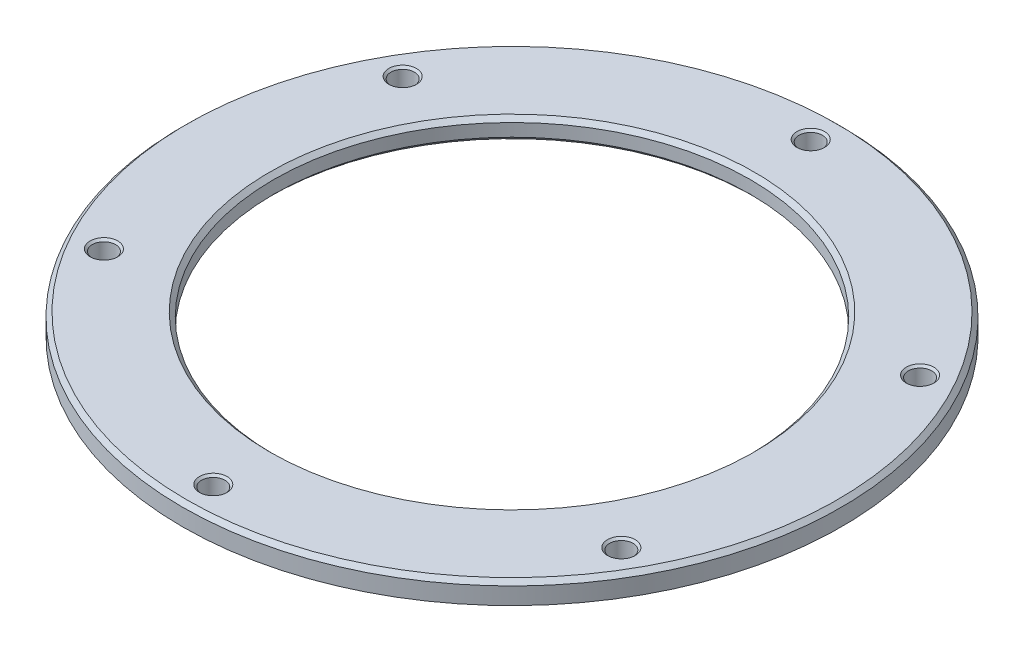
ISO-10303-21;
HEADER;
FILE_DESCRIPTION(('STEP AP214'),'2;1');
FILE_NAME('part.step','',(''),(''),'','','');
FILE_SCHEMA(('AUTOMOTIVE_DESIGN { 1 0 10303 214 1 1 1 1 }'));
ENDSEC;
DATA;
#1=APPLICATION_CONTEXT('core data for automotive mechanical design processes');
#2=APPLICATION_PROTOCOL_DEFINITION('international standard','automotive_design',2000,#1);
#3=PRODUCT_CONTEXT('',#1,'mechanical');
#4=PRODUCT('Part','Part','',(#3));
#5=PRODUCT_RELATED_PRODUCT_CATEGORY('part','',(#4));
#6=PRODUCT_DEFINITION_FORMATION('','',#4);
#7=PRODUCT_DEFINITION_CONTEXT('part definition',#1,'design');
#8=PRODUCT_DEFINITION('design','',#6,#7);
#9=PRODUCT_DEFINITION_SHAPE('','',#8);
#10=(LENGTH_UNIT() NAMED_UNIT(*) SI_UNIT(.MILLI.,.METRE.));
#11=(NAMED_UNIT(*) PLANE_ANGLE_UNIT() SI_UNIT($,.RADIAN.));
#12=(NAMED_UNIT(*) SI_UNIT($,.STERADIAN.) SOLID_ANGLE_UNIT());
#13=UNCERTAINTY_MEASURE_WITH_UNIT(LENGTH_MEASURE(1.E-05),#10,'distance_accuracy_value','');
#14=(GEOMETRIC_REPRESENTATION_CONTEXT(3) GLOBAL_UNCERTAINTY_ASSIGNED_CONTEXT((#13)) GLOBAL_UNIT_ASSIGNED_CONTEXT((#10,
#11,#12)) REPRESENTATION_CONTEXT('',''));
#15=CARTESIAN_POINT('',(0.,0.,0.));
#16=DIRECTION('',(0.,0.,1.));
#17=DIRECTION('',(1.,0.,0.));
#18=AXIS2_PLACEMENT_3D('',#15,#16,#17);
#19=CARTESIAN_POINT('',(0.,5.,0.));
#20=DIRECTION('',(0.,1.,0.));
#21=DIRECTION('',(0.,0.,1.));
#22=AXIS2_PLACEMENT_3D('',#19,#20,#21);
#23=PLANE('',#22);
#24=CARTESIAN_POINT('',(0.,5.,0.));
#25=DIRECTION('',(0.,1.,0.));
#26=DIRECTION('',(0.,0.,1.));
#27=AXIS2_PLACEMENT_3D('',#24,#25,#26);
#28=CIRCLE('',#27,57.);
#29=CARTESIAN_POINT('',(0.,5.,57.));
#30=VERTEX_POINT('',#29);
#31=EDGE_CURVE('E43',#30,#30,#28,.F.);
#32=ORIENTED_EDGE('',*,*,#31,.T.);
#33=EDGE_LOOP('',(#32));
#34=FACE_BOUND('',#33,.T.);
#35=CARTESIAN_POINT('',(0.,5.,0.));
#36=DIRECTION('',(0.,1.,0.));
#37=DIRECTION('',(0.,0.,1.));
#38=AXIS2_PLACEMENT_3D('',#35,#36,#37);
#39=CIRCLE('',#38,76.5);
#40=CARTESIAN_POINT('',(0.,5.,76.5));
#41=VERTEX_POINT('',#40);
#42=EDGE_CURVE('E47',#41,#41,#39,.T.);
#43=ORIENTED_EDGE('',*,*,#42,.T.);
#44=EDGE_LOOP('',(#43));
#45=FACE_BOUND('',#44,.T.);
#46=CARTESIAN_POINT('',(60.8382846158564,5.,-35.1250000000007));
#47=DIRECTION('',(0.,1.,0.));
#48=DIRECTION('',(0.,0.,1.));
#49=AXIS2_PLACEMENT_3D('',#46,#47,#48);
#50=CIRCLE('',#49,3.25000000000001);
#51=CARTESIAN_POINT('',(60.8382846158564,5.,-31.8750000000007));
#52=VERTEX_POINT('',#51);
#53=EDGE_CURVE('E65',#52,#52,#50,.F.);
#54=ORIENTED_EDGE('',*,*,#53,.T.);
#55=EDGE_LOOP('',(#54));
#56=FACE_BOUND('',#55,.T.);
#57=CARTESIAN_POINT('',(60.8382846158571,5.,35.1249999999994));
#58=DIRECTION('',(0.,1.,0.));
#59=DIRECTION('',(0.,0.,1.));
#60=AXIS2_PLACEMENT_3D('',#57,#58,#59);
#61=CIRCLE('',#60,3.24999999999998);
#62=CARTESIAN_POINT('',(60.8382846158571,5.,38.3749999999994));
#63=VERTEX_POINT('',#62);
#64=EDGE_CURVE('E77',#63,#63,#61,.F.);
#65=ORIENTED_EDGE('',*,*,#64,.T.);
#66=EDGE_LOOP('',(#65));
#67=FACE_BOUND('',#66,.T.);
#68=CARTESIAN_POINT('',(0.,5.,70.25));
#69=DIRECTION('',(0.,1.,0.));
#70=DIRECTION('',(0.,0.,1.));
#71=AXIS2_PLACEMENT_3D('',#68,#69,#70);
#72=CIRCLE('',#71,3.25);
#73=CARTESIAN_POINT('',(0.,5.,73.5));
#74=VERTEX_POINT('',#73);
#75=EDGE_CURVE('E89',#74,#74,#72,.F.);
#76=ORIENTED_EDGE('',*,*,#75,.T.);
#77=EDGE_LOOP('',(#76));
#78=FACE_BOUND('',#77,.T.);
#79=CARTESIAN_POINT('',(-60.8382846158567,5.,35.1250000000003));
#80=DIRECTION('',(0.,1.,0.));
#81=DIRECTION('',(0.,0.,1.));
#82=AXIS2_PLACEMENT_3D('',#79,#80,#81);
#83=CIRCLE('',#82,3.25);
#84=CARTESIAN_POINT('',(-60.8382846158567,5.,38.3750000000003));
#85=VERTEX_POINT('',#84);
#86=EDGE_CURVE('E101',#85,#85,#83,.F.);
#87=ORIENTED_EDGE('',*,*,#86,.T.);
#88=EDGE_LOOP('',(#87));
#89=FACE_BOUND('',#88,.T.);
#90=CARTESIAN_POINT('',(-60.8382846158569,5.,-35.1249999999999));
#91=DIRECTION('',(0.,1.,0.));
#92=DIRECTION('',(0.,0.,1.));
#93=AXIS2_PLACEMENT_3D('',#90,#91,#92);
#94=CIRCLE('',#93,3.24999999999999);
#95=CARTESIAN_POINT('',(-60.8382846158569,5.,-31.8749999999999));
#96=VERTEX_POINT('',#95);
#97=EDGE_CURVE('E113',#96,#96,#94,.F.);
#98=ORIENTED_EDGE('',*,*,#97,.T.);
#99=EDGE_LOOP('',(#98));
#100=FACE_BOUND('',#99,.T.);
#101=CARTESIAN_POINT('',(0.,5.,-70.25));
#102=DIRECTION('',(0.,1.,0.));
#103=DIRECTION('',(0.,0.,1.));
#104=AXIS2_PLACEMENT_3D('',#101,#102,#103);
#105=CIRCLE('',#104,3.25);
#106=CARTESIAN_POINT('',(0.,5.,-67.));
#107=VERTEX_POINT('',#106);
#108=EDGE_CURVE('E125',#107,#107,#105,.F.);
#109=ORIENTED_EDGE('',*,*,#108,.T.);
#110=EDGE_LOOP('',(#109));
#111=FACE_BOUND('',#110,.T.);
#112=ADVANCED_FACE('F35',(#34,#45,#56,#67,#78,#89,#100,#111),#23,.T.);
#113=CARTESIAN_POINT('',(0.,0.,0.));
#114=DIRECTION('',(0.,1.,0.));
#115=DIRECTION('',(0.,0.,1.));
#116=AXIS2_PLACEMENT_3D('',#113,#114,#115);
#117=PLANE('',#116);
#118=CARTESIAN_POINT('',(0.,0.,0.));
#119=DIRECTION('',(0.,1.,0.));
#120=DIRECTION('',(0.,0.,1.));
#121=AXIS2_PLACEMENT_3D('',#118,#119,#120);
#122=CIRCLE('',#121,57.);
#123=CARTESIAN_POINT('',(0.,0.,57.));
#124=VERTEX_POINT('',#123);
#125=EDGE_CURVE('E59',#124,#124,#122,.T.);
#126=ORIENTED_EDGE('',*,*,#125,.T.);
#127=EDGE_LOOP('',(#126));
#128=FACE_BOUND('',#127,.T.);
#129=CARTESIAN_POINT('',(60.8382846158564,0.,-35.1250000000007));
#130=DIRECTION('',(0.,1.,0.));
#131=DIRECTION('',(0.,0.,1.));
#132=AXIS2_PLACEMENT_3D('',#129,#130,#131);
#133=CIRCLE('',#132,3.24999999999997);
#134=CARTESIAN_POINT('',(60.8382846158564,0.,-31.8750000000007));
#135=VERTEX_POINT('',#134);
#136=EDGE_CURVE('E62',#135,#135,#133,.T.);
#137=ORIENTED_EDGE('',*,*,#136,.T.);
#138=EDGE_LOOP('',(#137));
#139=FACE_BOUND('',#138,.T.);
#140=CARTESIAN_POINT('',(60.8382846158571,0.,35.1249999999994));
#141=DIRECTION('',(0.,1.,0.));
#142=DIRECTION('',(0.,0.,1.));
#143=AXIS2_PLACEMENT_3D('',#140,#141,#142);
#144=CIRCLE('',#143,3.25000000000003);
#145=CARTESIAN_POINT('',(60.8382846158571,0.,38.3749999999995));
#146=VERTEX_POINT('',#145);
#147=EDGE_CURVE('E74',#146,#146,#144,.T.);
#148=ORIENTED_EDGE('',*,*,#147,.T.);
#149=EDGE_LOOP('',(#148));
#150=FACE_BOUND('',#149,.T.);
#151=CARTESIAN_POINT('',(0.,0.,70.25));
#152=DIRECTION('',(0.,1.,0.));
#153=DIRECTION('',(0.,0.,1.));
#154=AXIS2_PLACEMENT_3D('',#151,#152,#153);
#155=CIRCLE('',#154,3.24999999999995);
#156=CARTESIAN_POINT('',(0.,0.,73.5));
#157=VERTEX_POINT('',#156);
#158=EDGE_CURVE('E86',#157,#157,#155,.T.);
#159=ORIENTED_EDGE('',*,*,#158,.T.);
#160=EDGE_LOOP('',(#159));
#161=FACE_BOUND('',#160,.T.);
#162=CARTESIAN_POINT('',(-60.8382846158567,0.,35.1250000000003));
#163=DIRECTION('',(0.,1.,0.));
#164=DIRECTION('',(0.,0.,1.));
#165=AXIS2_PLACEMENT_3D('',#162,#163,#164);
#166=CIRCLE('',#165,3.24999999999999);
#167=CARTESIAN_POINT('',(-60.8382846158567,0.,38.3750000000003));
#168=VERTEX_POINT('',#167);
#169=EDGE_CURVE('E98',#168,#168,#166,.T.);
#170=ORIENTED_EDGE('',*,*,#169,.T.);
#171=EDGE_LOOP('',(#170));
#172=FACE_BOUND('',#171,.T.);
#173=CARTESIAN_POINT('',(-60.8382846158569,0.,-35.1249999999999));
#174=DIRECTION('',(0.,1.,0.));
#175=DIRECTION('',(0.,0.,1.));
#176=AXIS2_PLACEMENT_3D('',#173,#174,#175);
#177=CIRCLE('',#176,3.24999999999995);
#178=CARTESIAN_POINT('',(-60.8382846158569,0.,-31.8749999999999));
#179=VERTEX_POINT('',#178);
#180=EDGE_CURVE('E110',#179,#179,#177,.T.);
#181=ORIENTED_EDGE('',*,*,#180,.T.);
#182=EDGE_LOOP('',(#181));
#183=FACE_BOUND('',#182,.T.);
#184=CARTESIAN_POINT('',(0.,0.,-70.25));
#185=DIRECTION('',(0.,1.,0.));
#186=DIRECTION('',(0.,0.,1.));
#187=AXIS2_PLACEMENT_3D('',#184,#185,#186);
#188=CIRCLE('',#187,3.24999999999995);
#189=CARTESIAN_POINT('',(0.,0.,-67.0000000000001));
#190=VERTEX_POINT('',#189);
#191=EDGE_CURVE('E122',#190,#190,#188,.T.);
#192=ORIENTED_EDGE('',*,*,#191,.T.);
#193=EDGE_LOOP('',(#192));
#194=FACE_BOUND('',#193,.T.);
#195=CARTESIAN_POINT('',(0.,0.,0.));
#196=DIRECTION('',(0.,1.,0.));
#197=DIRECTION('',(0.,0.,1.));
#198=AXIS2_PLACEMENT_3D('',#195,#196,#197);
#199=CIRCLE('',#198,77.5);
#200=CARTESIAN_POINT('',(0.,0.,77.5));
#201=VERTEX_POINT('',#200);
#202=EDGE_CURVE('E134',#201,#201,#199,.T.);
#203=ORIENTED_EDGE('',*,*,#202,.F.);
#204=EDGE_LOOP('',(#203));
#205=FACE_BOUND('',#204,.T.);
#206=ADVANCED_FACE('F140',(#128,#139,#150,#161,#172,#183,#194,#205),#117,.F.);
#207=CARTESIAN_POINT('',(0.,5.,0.));
#208=DIRECTION('',(0.,-1.,0.));
#209=DIRECTION('',(0.,0.,-1.));
#210=AXIS2_PLACEMENT_3D('',#207,#208,#209);
#211=CYLINDRICAL_SURFACE('',#210,77.5);
#212=CARTESIAN_POINT('',(0.,3.99999999999997,0.));
#213=DIRECTION('',(0.,1.,0.));
#214=DIRECTION('',(0.,0.,1.));
#215=AXIS2_PLACEMENT_3D('',#212,#213,#214);
#216=CIRCLE('',#215,77.5);
#217=CARTESIAN_POINT('',(0.,3.99999999999997,77.5));
#218=VERTEX_POINT('',#217);
#219=EDGE_CURVE('E10',#218,#218,#216,.F.);
#220=ORIENTED_EDGE('',*,*,#219,.T.);
#221=EDGE_LOOP('',(#220));
#222=FACE_BOUND('',#221,.T.);
#223=ORIENTED_EDGE('',*,*,#202,.T.);
#224=EDGE_LOOP('',(#223));
#225=FACE_BOUND('',#224,.T.);
#226=ADVANCED_FACE('F138',(#222,#225),#211,.T.);
#227=CARTESIAN_POINT('',(0.,5.,0.));
#228=DIRECTION('',(0.,-1.,0.));
#229=DIRECTION('',(0.,0.,-1.));
#230=AXIS2_PLACEMENT_3D('',#227,#228,#229);
#231=CYLINDRICAL_SURFACE('',#230,56.);
#232=CARTESIAN_POINT('',(0.,1.00000000000001,0.));
#233=DIRECTION('',(0.,1.,0.));
#234=DIRECTION('',(0.,0.,1.));
#235=AXIS2_PLACEMENT_3D('',#232,#233,#234);
#236=CIRCLE('',#235,56.);
#237=CARTESIAN_POINT('',(0.,1.00000000000001,56.));
#238=VERTEX_POINT('',#237);
#239=EDGE_CURVE('E51',#238,#238,#236,.F.);
#240=ORIENTED_EDGE('',*,*,#239,.T.);
#241=EDGE_LOOP('',(#240));
#242=FACE_BOUND('',#241,.T.);
#243=CARTESIAN_POINT('',(0.,3.99999999999995,0.));
#244=DIRECTION('',(0.,1.,0.));
#245=DIRECTION('',(0.,0.,1.));
#246=AXIS2_PLACEMENT_3D('',#243,#244,#245);
#247=CIRCLE('',#246,56.);
#248=CARTESIAN_POINT('',(0.,3.99999999999995,56.));
#249=VERTEX_POINT('',#248);
#250=EDGE_CURVE('E56',#249,#249,#247,.T.);
#251=ORIENTED_EDGE('',*,*,#250,.T.);
#252=EDGE_LOOP('',(#251));
#253=FACE_BOUND('',#252,.T.);
#254=ADVANCED_FACE('F148',(#242,#253),#231,.F.);
#255=CARTESIAN_POINT('',(0.,0.,-70.25));
#256=DIRECTION('',(0.,1.,0.));
#257=DIRECTION('',(0.,0.,1.));
#258=AXIS2_PLACEMENT_3D('',#255,#256,#257);
#259=CYLINDRICAL_SURFACE('',#258,2.75);
#260=CARTESIAN_POINT('',(0.,4.49999999999996,-70.25));
#261=DIRECTION('',(0.,1.,0.));
#262=DIRECTION('',(0.,0.,1.));
#263=AXIS2_PLACEMENT_3D('',#260,#261,#262);
#264=CIRCLE('',#263,2.75);
#265=CARTESIAN_POINT('',(0.,4.49999999999996,-67.5));
#266=VERTEX_POINT('',#265);
#267=EDGE_CURVE('E128',#266,#266,#264,.T.);
#268=ORIENTED_EDGE('',*,*,#267,.T.);
#269=EDGE_LOOP('',(#268));
#270=FACE_BOUND('',#269,.T.);
#271=CARTESIAN_POINT('',(0.,0.499999999999956,-70.25));
#272=DIRECTION('',(0.,1.,0.));
#273=DIRECTION('',(0.,0.,1.));
#274=AXIS2_PLACEMENT_3D('',#271,#272,#273);
#275=CIRCLE('',#274,2.75);
#276=CARTESIAN_POINT('',(0.,0.499999999999956,-67.5));
#277=VERTEX_POINT('',#276);
#278=EDGE_CURVE('E131',#277,#277,#275,.F.);
#279=ORIENTED_EDGE('',*,*,#278,.T.);
#280=EDGE_LOOP('',(#279));
#281=FACE_BOUND('',#280,.T.);
#282=ADVANCED_FACE('F162',(#270,#281),#259,.F.);
#283=CARTESIAN_POINT('',(0.,4.49999999999996,-70.25));
#284=DIRECTION('',(0.,1.,0.));
#285=DIRECTION('',(0.,0.,1.));
#286=AXIS2_PLACEMENT_3D('',#283,#284,#285);
#287=CONICAL_SURFACE('',#286,2.75,0.785398163397411);
#288=ORIENTED_EDGE('',*,*,#108,.F.);
#289=EDGE_LOOP('',(#288));
#290=FACE_BOUND('',#289,.T.);
#291=ORIENTED_EDGE('',*,*,#267,.F.);
#292=EDGE_LOOP('',(#291));
#293=FACE_BOUND('',#292,.T.);
#294=ADVANCED_FACE('F155',(#290,#293),#287,.F.);
#295=CARTESIAN_POINT('',(0.,0.,-70.25));
#296=DIRECTION('',(0.,-1.,0.));
#297=DIRECTION('',(0.,0.,-1.));
#298=AXIS2_PLACEMENT_3D('',#295,#296,#297);
#299=CONICAL_SURFACE('',#298,3.24999999999995,0.785398163397439);
#300=ORIENTED_EDGE('',*,*,#278,.F.);
#301=EDGE_LOOP('',(#300));
#302=FACE_BOUND('',#301,.T.);
#303=ORIENTED_EDGE('',*,*,#191,.F.);
#304=EDGE_LOOP('',(#303));
#305=FACE_BOUND('',#304,.T.);
#306=ADVANCED_FACE('F161',(#302,#305),#299,.F.);
#307=CARTESIAN_POINT('',(-60.8382846158569,0.,-35.1249999999999));
#308=DIRECTION('',(0.,1.,0.));
#309=DIRECTION('',(0.,0.,1.));
#310=AXIS2_PLACEMENT_3D('',#307,#308,#309);
#311=CYLINDRICAL_SURFACE('',#310,2.75);
#312=CARTESIAN_POINT('',(-60.8382846158569,4.50000000000002,-35.1249999999999));
#313=DIRECTION('',(0.,1.,0.));
#314=DIRECTION('',(0.,0.,1.));
#315=AXIS2_PLACEMENT_3D('',#312,#313,#314);
#316=CIRCLE('',#315,2.75);
#317=CARTESIAN_POINT('',(-60.8382846158569,4.50000000000002,-32.3749999999999));
#318=VERTEX_POINT('',#317);
#319=EDGE_CURVE('E116',#318,#318,#316,.T.);
#320=ORIENTED_EDGE('',*,*,#319,.T.);
#321=EDGE_LOOP('',(#320));
#322=FACE_BOUND('',#321,.T.);
#323=CARTESIAN_POINT('',(-60.8382846158569,0.499999999999928,-35.1249999999999));
#324=DIRECTION('',(0.,1.,0.));
#325=DIRECTION('',(0.,0.,1.));
#326=AXIS2_PLACEMENT_3D('',#323,#324,#325);
#327=CIRCLE('',#326,2.75);
#328=CARTESIAN_POINT('',(-60.8382846158569,0.499999999999928,-32.3749999999999));
#329=VERTEX_POINT('',#328);
#330=EDGE_CURVE('E119',#329,#329,#327,.F.);
#331=ORIENTED_EDGE('',*,*,#330,.T.);
#332=EDGE_LOOP('',(#331));
#333=FACE_BOUND('',#332,.T.);
#334=ADVANCED_FACE('F169',(#322,#333),#311,.F.);
#335=CARTESIAN_POINT('',(-60.8382846158567,0.,35.1250000000003));
#336=DIRECTION('',(0.,1.,0.));
#337=DIRECTION('',(0.,0.,1.));
#338=AXIS2_PLACEMENT_3D('',#335,#336,#337);
#339=CYLINDRICAL_SURFACE('',#338,2.75);
#340=CARTESIAN_POINT('',(-60.8382846158567,4.49999999999999,35.1250000000003));
#341=DIRECTION('',(0.,1.,0.));
#342=DIRECTION('',(0.,0.,1.));
#343=AXIS2_PLACEMENT_3D('',#340,#341,#342);
#344=CIRCLE('',#343,2.75);
#345=CARTESIAN_POINT('',(-60.8382846158567,4.49999999999999,37.8750000000003));
#346=VERTEX_POINT('',#345);
#347=EDGE_CURVE('E104',#346,#346,#344,.T.);
#348=ORIENTED_EDGE('',*,*,#347,.T.);
#349=EDGE_LOOP('',(#348));
#350=FACE_BOUND('',#349,.T.);
#351=CARTESIAN_POINT('',(-60.8382846158567,0.500000000000011,35.1250000000003));
#352=DIRECTION('',(0.,1.,0.));
#353=DIRECTION('',(0.,0.,1.));
#354=AXIS2_PLACEMENT_3D('',#351,#352,#353);
#355=CIRCLE('',#354,2.75);
#356=CARTESIAN_POINT('',(-60.8382846158567,0.500000000000011,37.8750000000003));
#357=VERTEX_POINT('',#356);
#358=EDGE_CURVE('E107',#357,#357,#355,.F.);
#359=ORIENTED_EDGE('',*,*,#358,.T.);
#360=EDGE_LOOP('',(#359));
#361=FACE_BOUND('',#360,.T.);
#362=ADVANCED_FACE('F270',(#350,#361),#339,.F.);
#363=CARTESIAN_POINT('',(0.,0.,70.25));
#364=DIRECTION('',(0.,1.,0.));
#365=DIRECTION('',(0.,0.,1.));
#366=AXIS2_PLACEMENT_3D('',#363,#364,#365);
#367=CYLINDRICAL_SURFACE('',#366,2.75);
#368=CARTESIAN_POINT('',(0.,4.49999999999996,70.25));
#369=DIRECTION('',(0.,1.,0.));
#370=DIRECTION('',(0.,0.,1.));
#371=AXIS2_PLACEMENT_3D('',#368,#369,#370);
#372=CIRCLE('',#371,2.75);
#373=CARTESIAN_POINT('',(0.,4.49999999999996,73.));
#374=VERTEX_POINT('',#373);
#375=EDGE_CURVE('E92',#374,#374,#372,.T.);
#376=ORIENTED_EDGE('',*,*,#375,.T.);
#377=EDGE_LOOP('',(#376));
#378=FACE_BOUND('',#377,.T.);
#379=CARTESIAN_POINT('',(0.,0.499999999999956,70.25));
#380=DIRECTION('',(0.,1.,0.));
#381=DIRECTION('',(0.,0.,1.));
#382=AXIS2_PLACEMENT_3D('',#379,#380,#381);
#383=CIRCLE('',#382,2.75);
#384=CARTESIAN_POINT('',(0.,0.499999999999956,73.));
#385=VERTEX_POINT('',#384);
#386=EDGE_CURVE('E95',#385,#385,#383,.F.);
#387=ORIENTED_EDGE('',*,*,#386,.T.);
#388=EDGE_LOOP('',(#387));
#389=FACE_BOUND('',#388,.T.);
#390=ADVANCED_FACE('F278',(#378,#389),#367,.F.);
#391=CARTESIAN_POINT('',(60.8382846158571,0.,35.1249999999994));
#392=DIRECTION('',(0.,1.,0.));
#393=DIRECTION('',(0.,0.,1.));
#394=AXIS2_PLACEMENT_3D('',#391,#392,#393);
#395=CYLINDRICAL_SURFACE('',#394,2.75);
#396=CARTESIAN_POINT('',(60.8382846158571,4.50000000000002,35.1249999999994));
#397=DIRECTION('',(0.,1.,0.));
#398=DIRECTION('',(0.,0.,1.));
#399=AXIS2_PLACEMENT_3D('',#396,#397,#398);
#400=CIRCLE('',#399,2.75);
#401=CARTESIAN_POINT('',(60.8382846158571,4.50000000000002,37.8749999999994));
#402=VERTEX_POINT('',#401);
#403=EDGE_CURVE('E80',#402,#402,#400,.T.);
#404=ORIENTED_EDGE('',*,*,#403,.T.);
#405=EDGE_LOOP('',(#404));
#406=FACE_BOUND('',#405,.T.);
#407=CARTESIAN_POINT('',(60.8382846158571,0.500000000000012,35.1249999999994));
#408=DIRECTION('',(0.,1.,0.));
#409=DIRECTION('',(0.,0.,1.));
#410=AXIS2_PLACEMENT_3D('',#407,#408,#409);
#411=CIRCLE('',#410,2.75);
#412=CARTESIAN_POINT('',(60.8382846158571,0.500000000000012,37.8749999999994));
#413=VERTEX_POINT('',#412);
#414=EDGE_CURVE('E83',#413,#413,#411,.F.);
#415=ORIENTED_EDGE('',*,*,#414,.T.);
#416=EDGE_LOOP('',(#415));
#417=FACE_BOUND('',#416,.T.);
#418=ADVANCED_FACE('F274',(#406,#417),#395,.F.);
#419=CARTESIAN_POINT('',(60.8382846158564,0.,-35.1250000000007));
#420=DIRECTION('',(0.,1.,0.));
#421=DIRECTION('',(0.,0.,1.));
#422=AXIS2_PLACEMENT_3D('',#419,#420,#421);
#423=CYLINDRICAL_SURFACE('',#422,2.75);
#424=CARTESIAN_POINT('',(60.8382846158564,4.49999999999996,-35.1250000000007));
#425=DIRECTION('',(0.,1.,0.));
#426=DIRECTION('',(0.,0.,1.));
#427=AXIS2_PLACEMENT_3D('',#424,#425,#426);
#428=CIRCLE('',#427,2.75);
#429=CARTESIAN_POINT('',(60.8382846158564,4.49999999999996,-32.3750000000007));
#430=VERTEX_POINT('',#429);
#431=EDGE_CURVE('E68',#430,#430,#428,.T.);
#432=ORIENTED_EDGE('',*,*,#431,.T.);
#433=EDGE_LOOP('',(#432));
#434=FACE_BOUND('',#433,.T.);
#435=CARTESIAN_POINT('',(60.8382846158564,0.499999999999984,-35.1250000000007));
#436=DIRECTION('',(0.,1.,0.));
#437=DIRECTION('',(0.,0.,1.));
#438=AXIS2_PLACEMENT_3D('',#435,#436,#437);
#439=CIRCLE('',#438,2.75);
#440=CARTESIAN_POINT('',(60.8382846158564,0.499999999999984,-32.3750000000007));
#441=VERTEX_POINT('',#440);
#442=EDGE_CURVE('E71',#441,#441,#439,.F.);
#443=ORIENTED_EDGE('',*,*,#442,.T.);
#444=EDGE_LOOP('',(#443));
#445=FACE_BOUND('',#444,.T.);
#446=ADVANCED_FACE('F178',(#434,#445),#423,.F.);
#447=CARTESIAN_POINT('',(-60.8382846158569,4.50000000000002,-35.1249999999999));
#448=DIRECTION('',(0.,1.,0.));
#449=DIRECTION('',(0.,0.,1.));
#450=AXIS2_PLACEMENT_3D('',#447,#448,#449);
#451=CONICAL_SURFACE('',#450,2.75,0.785398163397451);
#452=ORIENTED_EDGE('',*,*,#97,.F.);
#453=EDGE_LOOP('',(#452));
#454=FACE_BOUND('',#453,.T.);
#455=ORIENTED_EDGE('',*,*,#319,.F.);
#456=EDGE_LOOP('',(#455));
#457=FACE_BOUND('',#456,.T.);
#458=ADVANCED_FACE('F171',(#454,#457),#451,.F.);
#459=CARTESIAN_POINT('',(-60.8382846158569,0.,-35.1249999999999));
#460=DIRECTION('',(0.,-1.,0.));
#461=DIRECTION('',(0.,0.,-1.));
#462=AXIS2_PLACEMENT_3D('',#459,#460,#461);
#463=CONICAL_SURFACE('',#462,3.24999999999995,0.785398163397472);
#464=ORIENTED_EDGE('',*,*,#330,.F.);
#465=EDGE_LOOP('',(#464));
#466=FACE_BOUND('',#465,.T.);
#467=ORIENTED_EDGE('',*,*,#180,.F.);
#468=EDGE_LOOP('',(#467));
#469=FACE_BOUND('',#468,.T.);
#470=ADVANCED_FACE('F177',(#466,#469),#463,.F.);
#471=CARTESIAN_POINT('',(-60.8382846158567,4.49999999999999,35.1250000000003));
#472=DIRECTION('',(0.,1.,0.));
#473=DIRECTION('',(0.,0.,1.));
#474=AXIS2_PLACEMENT_3D('',#471,#472,#473);
#475=CONICAL_SURFACE('',#474,2.75,0.785398163397441);
#476=ORIENTED_EDGE('',*,*,#86,.F.);
#477=EDGE_LOOP('',(#476));
#478=FACE_BOUND('',#477,.T.);
#479=ORIENTED_EDGE('',*,*,#347,.F.);
#480=EDGE_LOOP('',(#479));
#481=FACE_BOUND('',#480,.T.);
#482=ADVANCED_FACE('F185',(#478,#481),#475,.F.);
#483=CARTESIAN_POINT('',(-60.8382846158567,0.,35.1250000000003));
#484=DIRECTION('',(0.,-1.,0.));
#485=DIRECTION('',(0.,0.,-1.));
#486=AXIS2_PLACEMENT_3D('',#483,#484,#485);
#487=CONICAL_SURFACE('',#486,3.24999999999999,0.785398163397422);
#488=ORIENTED_EDGE('',*,*,#358,.F.);
#489=EDGE_LOOP('',(#488));
#490=FACE_BOUND('',#489,.T.);
#491=ORIENTED_EDGE('',*,*,#169,.F.);
#492=EDGE_LOOP('',(#491));
#493=FACE_BOUND('',#492,.T.);
#494=ADVANCED_FACE('F192',(#490,#493),#487,.F.);
#495=CARTESIAN_POINT('',(0.,4.49999999999996,70.25));
#496=DIRECTION('',(0.,1.,0.));
#497=DIRECTION('',(0.,0.,1.));
#498=AXIS2_PLACEMENT_3D('',#495,#496,#497);
#499=CONICAL_SURFACE('',#498,2.75,0.785398163397411);
#500=ORIENTED_EDGE('',*,*,#75,.F.);
#501=EDGE_LOOP('',(#500));
#502=FACE_BOUND('',#501,.T.);
#503=ORIENTED_EDGE('',*,*,#375,.F.);
#504=EDGE_LOOP('',(#503));
#505=FACE_BOUND('',#504,.T.);
#506=ADVANCED_FACE('F199',(#502,#505),#499,.F.);
#507=CARTESIAN_POINT('',(0.,0.,70.25));
#508=DIRECTION('',(0.,-1.,0.));
#509=DIRECTION('',(0.,0.,-1.));
#510=AXIS2_PLACEMENT_3D('',#507,#508,#509);
#511=CONICAL_SURFACE('',#510,3.24999999999995,0.785398163397439);
#512=ORIENTED_EDGE('',*,*,#386,.F.);
#513=EDGE_LOOP('',(#512));
#514=FACE_BOUND('',#513,.T.);
#515=ORIENTED_EDGE('',*,*,#158,.F.);
#516=EDGE_LOOP('',(#515));
#517=FACE_BOUND('',#516,.T.);
#518=ADVANCED_FACE('F206',(#514,#517),#511,.F.);
#519=CARTESIAN_POINT('',(60.8382846158571,4.50000000000002,35.1249999999994));
#520=DIRECTION('',(0.,1.,0.));
#521=DIRECTION('',(0.,0.,1.));
#522=AXIS2_PLACEMENT_3D('',#519,#520,#521);
#523=CONICAL_SURFACE('',#522,2.75,0.785398163397441);
#524=ORIENTED_EDGE('',*,*,#64,.F.);
#525=EDGE_LOOP('',(#524));
#526=FACE_BOUND('',#525,.T.);
#527=ORIENTED_EDGE('',*,*,#403,.F.);
#528=EDGE_LOOP('',(#527));
#529=FACE_BOUND('',#528,.T.);
#530=ADVANCED_FACE('F213',(#526,#529),#523,.F.);
#531=CARTESIAN_POINT('',(60.8382846158571,0.,35.1249999999994));
#532=DIRECTION('',(0.,-1.,0.));
#533=DIRECTION('',(0.,0.,-1.));
#534=AXIS2_PLACEMENT_3D('',#531,#532,#533);
#535=CONICAL_SURFACE('',#534,3.25000000000004,0.785398163397471);
#536=ORIENTED_EDGE('',*,*,#414,.F.);
#537=EDGE_LOOP('',(#536));
#538=FACE_BOUND('',#537,.T.);
#539=ORIENTED_EDGE('',*,*,#147,.F.);
#540=EDGE_LOOP('',(#539));
#541=FACE_BOUND('',#540,.T.);
#542=ADVANCED_FACE('F220',(#538,#541),#535,.F.);
#543=CARTESIAN_POINT('',(60.8382846158564,4.49999999999996,-35.1250000000007));
#544=DIRECTION('',(0.,1.,0.));
#545=DIRECTION('',(0.,0.,1.));
#546=AXIS2_PLACEMENT_3D('',#543,#544,#545);
#547=CONICAL_SURFACE('',#546,2.75,0.785398163397414);
#548=ORIENTED_EDGE('',*,*,#53,.F.);
#549=EDGE_LOOP('',(#548));
#550=FACE_BOUND('',#549,.T.);
#551=ORIENTED_EDGE('',*,*,#431,.F.);
#552=EDGE_LOOP('',(#551));
#553=FACE_BOUND('',#552,.T.);
#554=ADVANCED_FACE('F227',(#550,#553),#547,.F.);
#555=CARTESIAN_POINT('',(60.8382846158564,0.,-35.1250000000007));
#556=DIRECTION('',(0.,-1.,0.));
#557=DIRECTION('',(0.,0.,-1.));
#558=AXIS2_PLACEMENT_3D('',#555,#556,#557);
#559=CONICAL_SURFACE('',#558,3.24999999999997,0.785398163397438);
#560=ORIENTED_EDGE('',*,*,#442,.F.);
#561=EDGE_LOOP('',(#560));
#562=FACE_BOUND('',#561,.T.);
#563=ORIENTED_EDGE('',*,*,#136,.F.);
#564=EDGE_LOOP('',(#563));
#565=FACE_BOUND('',#564,.T.);
#566=ADVANCED_FACE('F234',(#562,#565),#559,.F.);
#567=CARTESIAN_POINT('',(0.,0.,0.));
#568=DIRECTION('',(0.,-1.,0.));
#569=DIRECTION('',(0.,0.,-1.));
#570=AXIS2_PLACEMENT_3D('',#567,#568,#569);
#571=CONICAL_SURFACE('',#570,57.,0.785398163397445);
#572=ORIENTED_EDGE('',*,*,#239,.F.);
#573=EDGE_LOOP('',(#572));
#574=FACE_BOUND('',#573,.T.);
#575=ORIENTED_EDGE('',*,*,#125,.F.);
#576=EDGE_LOOP('',(#575));
#577=FACE_BOUND('',#576,.T.);
#578=ADVANCED_FACE('F241',(#574,#577),#571,.F.);
#579=CARTESIAN_POINT('',(0.,3.99999999999995,0.));
#580=DIRECTION('',(0.,1.,0.));
#581=DIRECTION('',(0.,0.,1.));
#582=AXIS2_PLACEMENT_3D('',#579,#580,#581);
#583=CONICAL_SURFACE('',#582,56.,0.785398163397448);
#584=ORIENTED_EDGE('',*,*,#31,.F.);
#585=EDGE_LOOP('',(#584));
#586=FACE_BOUND('',#585,.T.);
#587=ORIENTED_EDGE('',*,*,#250,.F.);
#588=EDGE_LOOP('',(#587));
#589=FACE_BOUND('',#588,.T.);
#590=ADVANCED_FACE('F247',(#586,#589),#583,.F.);
#591=CARTESIAN_POINT('',(0.,5.,0.));
#592=DIRECTION('',(0.,-1.,0.));
#593=DIRECTION('',(0.,0.,-1.));
#594=AXIS2_PLACEMENT_3D('',#591,#592,#593);
#595=CONICAL_SURFACE('',#594,76.5,0.785398163397441);
#596=ORIENTED_EDGE('',*,*,#219,.F.);
#597=EDGE_LOOP('',(#596));
#598=FACE_BOUND('',#597,.T.);
#599=ORIENTED_EDGE('',*,*,#42,.F.);
#600=EDGE_LOOP('',(#599));
#601=FACE_BOUND('',#600,.T.);
#602=ADVANCED_FACE('F38',(#598,#601),#595,.T.);
#603=CLOSED_SHELL('',(#112,#206,#226,#254,#282,#294,#306,#334,#362,#390,#418,#446,#458,#470,
#482,#494,#506,#518,#530,#542,#554,#566,#578,#590,#602));
#604=MANIFOLD_SOLID_BREP('B2',#603);
#605=ADVANCED_BREP_SHAPE_REPRESENTATION('',(#18,#604),#14);
#606=SHAPE_DEFINITION_REPRESENTATION(#9,#605);
ENDSEC;
END-ISO-10303-21;
